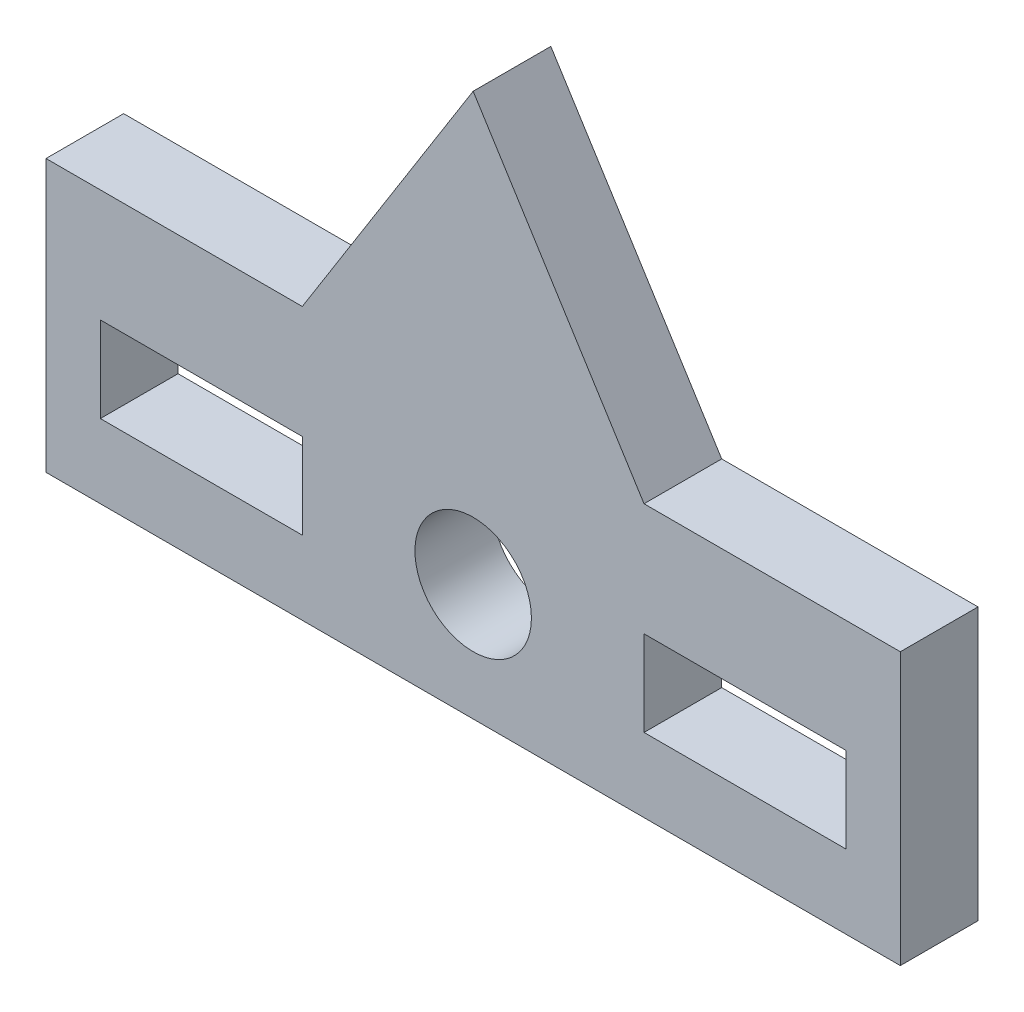
ISO-10303-21;
HEADER;
FILE_DESCRIPTION(('STEP AP214'),'2;1');
FILE_NAME('part.step','',(''),(''),'','','');
FILE_SCHEMA(('AUTOMOTIVE_DESIGN { 1 0 10303 214 1 1 1 1 }'));
ENDSEC;
DATA;
#1=APPLICATION_CONTEXT('core data for automotive mechanical design processes');
#2=APPLICATION_PROTOCOL_DEFINITION('international standard','automotive_design',2000,#1);
#3=PRODUCT_CONTEXT('',#1,'mechanical');
#4=PRODUCT('Part','Part','',(#3));
#5=PRODUCT_RELATED_PRODUCT_CATEGORY('part','',(#4));
#6=PRODUCT_DEFINITION_FORMATION('','',#4);
#7=PRODUCT_DEFINITION_CONTEXT('part definition',#1,'design');
#8=PRODUCT_DEFINITION('design','',#6,#7);
#9=PRODUCT_DEFINITION_SHAPE('','',#8);
#10=(LENGTH_UNIT() NAMED_UNIT(*) SI_UNIT(.MILLI.,.METRE.));
#11=(NAMED_UNIT(*) PLANE_ANGLE_UNIT() SI_UNIT($,.RADIAN.));
#12=(NAMED_UNIT(*) SI_UNIT($,.STERADIAN.) SOLID_ANGLE_UNIT());
#13=UNCERTAINTY_MEASURE_WITH_UNIT(LENGTH_MEASURE(1.E-05),#10,'distance_accuracy_value','');
#14=(GEOMETRIC_REPRESENTATION_CONTEXT(3) GLOBAL_UNCERTAINTY_ASSIGNED_CONTEXT((#13)) GLOBAL_UNIT_ASSIGNED_CONTEXT((#10,
#11,#12)) REPRESENTATION_CONTEXT('',''));
#15=CARTESIAN_POINT('',(0.,0.,0.));
#16=DIRECTION('',(0.,0.,1.));
#17=DIRECTION('',(1.,0.,0.));
#18=AXIS2_PLACEMENT_3D('',#15,#16,#17);
#19=CARTESIAN_POINT('',(0.,0.,2.));
#20=DIRECTION('',(0.,0.,1.));
#21=DIRECTION('',(1.,0.,0.));
#22=AXIS2_PLACEMENT_3D('',#19,#20,#21);
#23=PLANE('',#22);
#24=DIRECTION('',(-0.532171545218346,0.846636549211005,0.));
#25=VECTOR('',#24,1.);
#26=CARTESIAN_POINT('',(0.,11.,2.));
#27=LINE('',#26,#25);
#28=CARTESIAN_POINT('',(4.4,4.,2.));
#29=VERTEX_POINT('',#28);
#30=CARTESIAN_POINT('',(0.,11.,2.));
#31=VERTEX_POINT('',#30);
#32=EDGE_CURVE('E214',#29,#31,#27,.T.);
#33=ORIENTED_EDGE('',*,*,#32,.T.);
#34=DIRECTION('',(-0.532171545218346,-0.846636549211005,0.));
#35=VECTOR('',#34,1.);
#36=CARTESIAN_POINT('',(-4.4,4.,2.));
#37=LINE('',#36,#35);
#38=CARTESIAN_POINT('',(-4.4,4.,2.));
#39=VERTEX_POINT('',#38);
#40=EDGE_CURVE('E217',#31,#39,#37,.T.);
#41=ORIENTED_EDGE('',*,*,#40,.T.);
#42=DIRECTION('',(-1.,0.,0.));
#43=VECTOR('',#42,1.);
#44=CARTESIAN_POINT('',(-11.,4.,2.));
#45=LINE('',#44,#43);
#46=CARTESIAN_POINT('',(-11.,4.,2.));
#47=VERTEX_POINT('',#46);
#48=EDGE_CURVE('E220',#39,#47,#45,.T.);
#49=ORIENTED_EDGE('',*,*,#48,.T.);
#50=DIRECTION('',(0.,-1.,0.));
#51=VECTOR('',#50,1.);
#52=CARTESIAN_POINT('',(-11.,0.,2.));
#53=LINE('',#52,#51);
#54=CARTESIAN_POINT('',(-11.,-3.,2.));
#55=VERTEX_POINT('',#54);
#56=EDGE_CURVE('E222',#47,#55,#53,.T.);
#57=ORIENTED_EDGE('',*,*,#56,.T.);
#58=DIRECTION('',(1.,0.,0.));
#59=VECTOR('',#58,1.);
#60=CARTESIAN_POINT('',(-11.,-3.,2.));
#61=LINE('',#60,#59);
#62=CARTESIAN_POINT('',(11.,-3.,2.));
#63=VERTEX_POINT('',#62);
#64=EDGE_CURVE('E224',#55,#63,#61,.T.);
#65=ORIENTED_EDGE('',*,*,#64,.T.);
#66=DIRECTION('',(0.,1.,0.));
#67=VECTOR('',#66,1.);
#68=CARTESIAN_POINT('',(11.,0.,2.));
#69=LINE('',#68,#67);
#70=CARTESIAN_POINT('',(11.,4.,2.));
#71=VERTEX_POINT('',#70);
#72=EDGE_CURVE('E226',#63,#71,#69,.T.);
#73=ORIENTED_EDGE('',*,*,#72,.T.);
#74=DIRECTION('',(-1.,0.,0.));
#75=VECTOR('',#74,1.);
#76=CARTESIAN_POINT('',(4.4,4.,2.));
#77=LINE('',#76,#75);
#78=EDGE_CURVE('E228',#71,#29,#77,.T.);
#79=ORIENTED_EDGE('',*,*,#78,.T.);
#80=EDGE_LOOP('',(#33,#41,#49,#57,#65,#73,#79));
#81=FACE_BOUND('',#80,.T.);
#82=CARTESIAN_POINT('',(0.,0.,2.));
#83=DIRECTION('',(0.,0.,1.));
#84=DIRECTION('',(1.,0.,0.));
#85=AXIS2_PLACEMENT_3D('',#82,#83,#84);
#86=CIRCLE('',#85,1.5);
#87=CARTESIAN_POINT('',(1.5,0.,2.));
#88=VERTEX_POINT('',#87);
#89=EDGE_CURVE('E208',#88,#88,#86,.T.);
#90=ORIENTED_EDGE('',*,*,#89,.F.);
#91=EDGE_LOOP('',(#90));
#92=FACE_BOUND('',#91,.T.);
#93=DIRECTION('',(1.,0.,0.));
#94=VECTOR('',#93,1.);
#95=CARTESIAN_POINT('',(9.6,-1.1,2.));
#96=LINE('',#95,#94);
#97=CARTESIAN_POINT('',(4.4,-1.1,2.));
#98=VERTEX_POINT('',#97);
#99=CARTESIAN_POINT('',(9.6,-1.1,2.));
#100=VERTEX_POINT('',#99);
#101=EDGE_CURVE('E179',#98,#100,#96,.T.);
#102=ORIENTED_EDGE('',*,*,#101,.F.);
#103=DIRECTION('',(0.,-1.,0.));
#104=VECTOR('',#103,1.);
#105=CARTESIAN_POINT('',(4.4,1.1,2.));
#106=LINE('',#105,#104);
#107=CARTESIAN_POINT('',(4.4,1.1,2.));
#108=VERTEX_POINT('',#107);
#109=EDGE_CURVE('E177',#108,#98,#106,.T.);
#110=ORIENTED_EDGE('',*,*,#109,.F.);
#111=DIRECTION('',(-1.,0.,0.));
#112=VECTOR('',#111,1.);
#113=CARTESIAN_POINT('',(9.6,1.1,2.));
#114=LINE('',#113,#112);
#115=CARTESIAN_POINT('',(9.6,1.1,2.));
#116=VERTEX_POINT('',#115);
#117=EDGE_CURVE('E185',#116,#108,#114,.T.);
#118=ORIENTED_EDGE('',*,*,#117,.F.);
#119=DIRECTION('',(0.,1.,0.));
#120=VECTOR('',#119,1.);
#121=CARTESIAN_POINT('',(9.6,1.1,2.));
#122=LINE('',#121,#120);
#123=EDGE_CURVE('E182',#100,#116,#122,.T.);
#124=ORIENTED_EDGE('',*,*,#123,.F.);
#125=EDGE_LOOP('',(#102,#110,#118,#124));
#126=FACE_BOUND('',#125,.T.);
#127=DIRECTION('',(1.,0.,0.));
#128=VECTOR('',#127,1.);
#129=CARTESIAN_POINT('',(-9.6,-1.1,2.));
#130=LINE('',#129,#128);
#131=CARTESIAN_POINT('',(-9.6,-1.1,2.));
#132=VERTEX_POINT('',#131);
#133=CARTESIAN_POINT('',(-4.4,-1.1,2.));
#134=VERTEX_POINT('',#133);
#135=EDGE_CURVE('E149',#132,#134,#130,.T.);
#136=ORIENTED_EDGE('',*,*,#135,.F.);
#137=DIRECTION('',(0.,-1.,0.));
#138=VECTOR('',#137,1.);
#139=CARTESIAN_POINT('',(-9.6,1.1,2.));
#140=LINE('',#139,#138);
#141=CARTESIAN_POINT('',(-9.6,1.1,2.));
#142=VERTEX_POINT('',#141);
#143=EDGE_CURVE('E141',#142,#132,#140,.T.);
#144=ORIENTED_EDGE('',*,*,#143,.F.);
#145=DIRECTION('',(-1.,0.,0.));
#146=VECTOR('',#145,1.);
#147=CARTESIAN_POINT('',(-9.6,1.1,2.));
#148=LINE('',#147,#146);
#149=CARTESIAN_POINT('',(-4.4,1.1,2.));
#150=VERTEX_POINT('',#149);
#151=EDGE_CURVE('E163',#150,#142,#148,.T.);
#152=ORIENTED_EDGE('',*,*,#151,.F.);
#153=DIRECTION('',(0.,1.,0.));
#154=VECTOR('',#153,1.);
#155=CARTESIAN_POINT('',(-4.4,1.1,2.));
#156=LINE('',#155,#154);
#157=EDGE_CURVE('E161',#134,#150,#156,.T.);
#158=ORIENTED_EDGE('',*,*,#157,.F.);
#159=EDGE_LOOP('',(#136,#144,#152,#158));
#160=FACE_BOUND('',#159,.T.);
#161=ADVANCED_FACE('F34',(#81,#92,#126,#160),#23,.T.);
#162=CARTESIAN_POINT('',(0.,0.,0.));
#163=DIRECTION('',(0.,0.,1.));
#164=DIRECTION('',(1.,0.,0.));
#165=AXIS2_PLACEMENT_3D('',#162,#163,#164);
#166=PLANE('',#165);
#167=DIRECTION('',(0.,-1.,0.));
#168=VECTOR('',#167,1.);
#169=CARTESIAN_POINT('',(4.4,1.1,0.));
#170=LINE('',#169,#168);
#171=CARTESIAN_POINT('',(4.4,1.1,0.));
#172=VERTEX_POINT('',#171);
#173=CARTESIAN_POINT('',(4.4,-1.1,0.));
#174=VERTEX_POINT('',#173);
#175=EDGE_CURVE('E157',#172,#174,#170,.T.);
#176=ORIENTED_EDGE('',*,*,#175,.T.);
#177=DIRECTION('',(1.,0.,0.));
#178=VECTOR('',#177,1.);
#179=CARTESIAN_POINT('',(9.6,-1.1,0.));
#180=LINE('',#179,#178);
#181=CARTESIAN_POINT('',(9.6,-1.1,0.));
#182=VERTEX_POINT('',#181);
#183=EDGE_CURVE('E190',#174,#182,#180,.T.);
#184=ORIENTED_EDGE('',*,*,#183,.T.);
#185=DIRECTION('',(0.,1.,0.));
#186=VECTOR('',#185,1.);
#187=CARTESIAN_POINT('',(9.6,1.1,0.));
#188=LINE('',#187,#186);
#189=CARTESIAN_POINT('',(9.6,1.1,0.));
#190=VERTEX_POINT('',#189);
#191=EDGE_CURVE('E193',#182,#190,#188,.T.);
#192=ORIENTED_EDGE('',*,*,#191,.T.);
#193=DIRECTION('',(-1.,0.,0.));
#194=VECTOR('',#193,1.);
#195=CARTESIAN_POINT('',(9.6,1.1,0.));
#196=LINE('',#195,#194);
#197=EDGE_CURVE('E180',#190,#172,#196,.T.);
#198=ORIENTED_EDGE('',*,*,#197,.T.);
#199=EDGE_LOOP('',(#176,#184,#192,#198));
#200=FACE_BOUND('',#199,.T.);
#201=DIRECTION('',(-0.532171545218346,0.846636549211005,0.));
#202=VECTOR('',#201,1.);
#203=CARTESIAN_POINT('',(0.,11.,0.));
#204=LINE('',#203,#202);
#205=CARTESIAN_POINT('',(4.4,4.,0.));
#206=VERTEX_POINT('',#205);
#207=CARTESIAN_POINT('',(0.,11.,0.));
#208=VERTEX_POINT('',#207);
#209=EDGE_CURVE('E211',#206,#208,#204,.T.);
#210=ORIENTED_EDGE('',*,*,#209,.F.);
#211=DIRECTION('',(-1.,0.,0.));
#212=VECTOR('',#211,1.);
#213=CARTESIAN_POINT('',(4.4,4.,0.));
#214=LINE('',#213,#212);
#215=CARTESIAN_POINT('',(11.,4.,0.));
#216=VERTEX_POINT('',#215);
#217=EDGE_CURVE('E218',#216,#206,#214,.T.);
#218=ORIENTED_EDGE('',*,*,#217,.F.);
#219=DIRECTION('',(0.,1.,0.));
#220=VECTOR('',#219,1.);
#221=CARTESIAN_POINT('',(11.,4.,0.));
#222=LINE('',#221,#220);
#223=CARTESIAN_POINT('',(11.,-3.,0.));
#224=VERTEX_POINT('',#223);
#225=EDGE_CURVE('E243',#224,#216,#222,.T.);
#226=ORIENTED_EDGE('',*,*,#225,.F.);
#227=DIRECTION('',(1.,0.,0.));
#228=VECTOR('',#227,1.);
#229=CARTESIAN_POINT('',(-11.,-3.,0.));
#230=LINE('',#229,#228);
#231=CARTESIAN_POINT('',(-11.,-3.,0.));
#232=VERTEX_POINT('',#231);
#233=EDGE_CURVE('E240',#232,#224,#230,.T.);
#234=ORIENTED_EDGE('',*,*,#233,.F.);
#235=DIRECTION('',(0.,-1.,0.));
#236=VECTOR('',#235,1.);
#237=CARTESIAN_POINT('',(-11.,0.,0.));
#238=LINE('',#237,#236);
#239=CARTESIAN_POINT('',(-11.,4.,0.));
#240=VERTEX_POINT('',#239);
#241=EDGE_CURVE('E238',#240,#232,#238,.T.);
#242=ORIENTED_EDGE('',*,*,#241,.F.);
#243=DIRECTION('',(-1.,0.,0.));
#244=VECTOR('',#243,1.);
#245=CARTESIAN_POINT('',(-11.,4.,0.));
#246=LINE('',#245,#244);
#247=CARTESIAN_POINT('',(-4.4,4.,0.));
#248=VERTEX_POINT('',#247);
#249=EDGE_CURVE('E235',#248,#240,#246,.T.);
#250=ORIENTED_EDGE('',*,*,#249,.F.);
#251=DIRECTION('',(-0.532171545218346,-0.846636549211005,0.));
#252=VECTOR('',#251,1.);
#253=CARTESIAN_POINT('',(-4.4,4.,0.));
#254=LINE('',#253,#252);
#255=EDGE_CURVE('E233',#208,#248,#254,.T.);
#256=ORIENTED_EDGE('',*,*,#255,.F.);
#257=EDGE_LOOP('',(#210,#218,#226,#234,#242,#250,#256));
#258=FACE_BOUND('',#257,.T.);
#259=CARTESIAN_POINT('',(0.,0.,0.));
#260=DIRECTION('',(0.,0.,1.));
#261=DIRECTION('',(1.,0.,0.));
#262=AXIS2_PLACEMENT_3D('',#259,#260,#261);
#263=CIRCLE('',#262,1.5);
#264=CARTESIAN_POINT('',(1.5,0.,0.));
#265=VERTEX_POINT('',#264);
#266=EDGE_CURVE('E207',#265,#265,#263,.T.);
#267=ORIENTED_EDGE('',*,*,#266,.T.);
#268=EDGE_LOOP('',(#267));
#269=FACE_BOUND('',#268,.T.);
#270=DIRECTION('',(0.,-1.,0.));
#271=VECTOR('',#270,1.);
#272=CARTESIAN_POINT('',(-9.6,1.1,0.));
#273=LINE('',#272,#271);
#274=CARTESIAN_POINT('',(-9.6,1.1,0.));
#275=VERTEX_POINT('',#274);
#276=CARTESIAN_POINT('',(-9.6,-1.1,0.));
#277=VERTEX_POINT('',#276);
#278=EDGE_CURVE('E57',#275,#277,#273,.T.);
#279=ORIENTED_EDGE('',*,*,#278,.T.);
#280=DIRECTION('',(1.,0.,0.));
#281=VECTOR('',#280,1.);
#282=CARTESIAN_POINT('',(-9.6,-1.1,0.));
#283=LINE('',#282,#281);
#284=CARTESIAN_POINT('',(-4.4,-1.1,0.));
#285=VERTEX_POINT('',#284);
#286=EDGE_CURVE('E156',#277,#285,#283,.T.);
#287=ORIENTED_EDGE('',*,*,#286,.T.);
#288=DIRECTION('',(0.,1.,0.));
#289=VECTOR('',#288,1.);
#290=CARTESIAN_POINT('',(-4.4,1.1,0.));
#291=LINE('',#290,#289);
#292=CARTESIAN_POINT('',(-4.4,1.1,0.));
#293=VERTEX_POINT('',#292);
#294=EDGE_CURVE('E169',#285,#293,#291,.T.);
#295=ORIENTED_EDGE('',*,*,#294,.T.);
#296=DIRECTION('',(-1.,0.,0.));
#297=VECTOR('',#296,1.);
#298=CARTESIAN_POINT('',(-9.6,1.1,0.));
#299=LINE('',#298,#297);
#300=EDGE_CURVE('E150',#293,#275,#299,.T.);
#301=ORIENTED_EDGE('',*,*,#300,.T.);
#302=EDGE_LOOP('',(#279,#287,#295,#301));
#303=FACE_BOUND('',#302,.T.);
#304=ADVANCED_FACE('F269',(#200,#258,#269,#303),#166,.F.);
#305=CARTESIAN_POINT('',(0.,11.,2.));
#306=DIRECTION('',(-0.846636549211005,-0.532171545218346,0.));
#307=DIRECTION('',(0.532171545218346,-0.846636549211005,0.));
#308=AXIS2_PLACEMENT_3D('',#305,#306,#307);
#309=PLANE('',#308);
#310=ORIENTED_EDGE('',*,*,#209,.T.);
#311=DIRECTION('',(0.,0.,-1.));
#312=VECTOR('',#311,1.);
#313=CARTESIAN_POINT('',(0.,11.,2.));
#314=LINE('',#313,#312);
#315=EDGE_CURVE('E11',#31,#208,#314,.T.);
#316=ORIENTED_EDGE('',*,*,#315,.F.);
#317=ORIENTED_EDGE('',*,*,#32,.F.);
#318=DIRECTION('',(0.,0.,-1.));
#319=VECTOR('',#318,1.);
#320=CARTESIAN_POINT('',(4.4,4.,2.));
#321=LINE('',#320,#319);
#322=EDGE_CURVE('E230',#29,#206,#321,.T.);
#323=ORIENTED_EDGE('',*,*,#322,.T.);
#324=EDGE_LOOP('',(#310,#316,#317,#323));
#325=FACE_BOUND('',#324,.T.);
#326=ADVANCED_FACE('F36',(#325),#309,.F.);
#327=CARTESIAN_POINT('',(-4.4,4.,2.));
#328=DIRECTION('',(0.846636549211005,-0.532171545218346,0.));
#329=DIRECTION('',(0.532171545218346,0.846636549211005,0.));
#330=AXIS2_PLACEMENT_3D('',#327,#328,#329);
#331=PLANE('',#330);
#332=ORIENTED_EDGE('',*,*,#255,.T.);
#333=DIRECTION('',(0.,0.,-1.));
#334=VECTOR('',#333,1.);
#335=CARTESIAN_POINT('',(-4.4,4.,2.));
#336=LINE('',#335,#334);
#337=EDGE_CURVE('E42',#39,#248,#336,.T.);
#338=ORIENTED_EDGE('',*,*,#337,.F.);
#339=ORIENTED_EDGE('',*,*,#40,.F.);
#340=ORIENTED_EDGE('',*,*,#315,.T.);
#341=EDGE_LOOP('',(#332,#338,#339,#340));
#342=FACE_BOUND('',#341,.T.);
#343=ADVANCED_FACE('F286',(#342),#331,.F.);
#344=CARTESIAN_POINT('',(-11.,4.,2.));
#345=DIRECTION('',(0.,-1.,0.));
#346=DIRECTION('',(0.,0.,-1.));
#347=AXIS2_PLACEMENT_3D('',#344,#345,#346);
#348=PLANE('',#347);
#349=ORIENTED_EDGE('',*,*,#249,.T.);
#350=DIRECTION('',(0.,0.,-1.));
#351=VECTOR('',#350,1.);
#352=CARTESIAN_POINT('',(-11.,4.,2.));
#353=LINE('',#352,#351);
#354=EDGE_CURVE('E257',#47,#240,#353,.T.);
#355=ORIENTED_EDGE('',*,*,#354,.F.);
#356=ORIENTED_EDGE('',*,*,#48,.F.);
#357=ORIENTED_EDGE('',*,*,#337,.T.);
#358=EDGE_LOOP('',(#349,#355,#356,#357));
#359=FACE_BOUND('',#358,.T.);
#360=ADVANCED_FACE('F264',(#359),#348,.F.);
#361=CARTESIAN_POINT('',(-11.,0.,2.));
#362=DIRECTION('',(1.,0.,0.));
#363=DIRECTION('',(0.,0.,-1.));
#364=AXIS2_PLACEMENT_3D('',#361,#362,#363);
#365=PLANE('',#364);
#366=ORIENTED_EDGE('',*,*,#241,.T.);
#367=DIRECTION('',(0.,0.,-1.));
#368=VECTOR('',#367,1.);
#369=CARTESIAN_POINT('',(-11.,-3.,2.));
#370=LINE('',#369,#368);
#371=EDGE_CURVE('E254',#55,#232,#370,.T.);
#372=ORIENTED_EDGE('',*,*,#371,.F.);
#373=ORIENTED_EDGE('',*,*,#56,.F.);
#374=ORIENTED_EDGE('',*,*,#354,.T.);
#375=EDGE_LOOP('',(#366,#372,#373,#374));
#376=FACE_BOUND('',#375,.T.);
#377=ADVANCED_FACE('F274',(#376),#365,.F.);
#378=CARTESIAN_POINT('',(-11.,-3.,2.));
#379=DIRECTION('',(0.,1.,0.));
#380=DIRECTION('',(0.,0.,1.));
#381=AXIS2_PLACEMENT_3D('',#378,#379,#380);
#382=PLANE('',#381);
#383=ORIENTED_EDGE('',*,*,#233,.T.);
#384=DIRECTION('',(0.,0.,-1.));
#385=VECTOR('',#384,1.);
#386=CARTESIAN_POINT('',(11.,-3.,2.));
#387=LINE('',#386,#385);
#388=EDGE_CURVE('E251',#63,#224,#387,.T.);
#389=ORIENTED_EDGE('',*,*,#388,.F.);
#390=ORIENTED_EDGE('',*,*,#64,.F.);
#391=ORIENTED_EDGE('',*,*,#371,.T.);
#392=EDGE_LOOP('',(#383,#389,#390,#391));
#393=FACE_BOUND('',#392,.T.);
#394=ADVANCED_FACE('F278',(#393),#382,.F.);
#395=CARTESIAN_POINT('',(11.,4.,2.));
#396=DIRECTION('',(-1.,0.,0.));
#397=DIRECTION('',(0.,0.,1.));
#398=AXIS2_PLACEMENT_3D('',#395,#396,#397);
#399=PLANE('',#398);
#400=ORIENTED_EDGE('',*,*,#225,.T.);
#401=DIRECTION('',(0.,0.,-1.));
#402=VECTOR('',#401,1.);
#403=CARTESIAN_POINT('',(11.,4.,2.));
#404=LINE('',#403,#402);
#405=EDGE_CURVE('E248',#71,#216,#404,.T.);
#406=ORIENTED_EDGE('',*,*,#405,.F.);
#407=ORIENTED_EDGE('',*,*,#72,.F.);
#408=ORIENTED_EDGE('',*,*,#388,.T.);
#409=EDGE_LOOP('',(#400,#406,#407,#408));
#410=FACE_BOUND('',#409,.T.);
#411=ADVANCED_FACE('F294',(#410),#399,.F.);
#412=CARTESIAN_POINT('',(4.4,4.,2.));
#413=DIRECTION('',(0.,-1.,0.));
#414=DIRECTION('',(0.,0.,-1.));
#415=AXIS2_PLACEMENT_3D('',#412,#413,#414);
#416=PLANE('',#415);
#417=ORIENTED_EDGE('',*,*,#217,.T.);
#418=ORIENTED_EDGE('',*,*,#322,.F.);
#419=ORIENTED_EDGE('',*,*,#78,.F.);
#420=ORIENTED_EDGE('',*,*,#405,.T.);
#421=EDGE_LOOP('',(#417,#418,#419,#420));
#422=FACE_BOUND('',#421,.T.);
#423=ADVANCED_FACE('F291',(#422),#416,.F.);
#424=CARTESIAN_POINT('',(0.,0.,2.));
#425=DIRECTION('',(0.,0.,-1.));
#426=DIRECTION('',(-1.,0.,0.));
#427=AXIS2_PLACEMENT_3D('',#424,#425,#426);
#428=CYLINDRICAL_SURFACE('',#427,1.5);
#429=ORIENTED_EDGE('',*,*,#89,.T.);
#430=EDGE_LOOP('',(#429));
#431=FACE_BOUND('',#430,.T.);
#432=ORIENTED_EDGE('',*,*,#266,.F.);
#433=EDGE_LOOP('',(#432));
#434=FACE_BOUND('',#433,.T.);
#435=ADVANCED_FACE('F301',(#431,#434),#428,.F.);
#436=CARTESIAN_POINT('',(4.4,1.1,2.));
#437=DIRECTION('',(1.,0.,0.));
#438=DIRECTION('',(0.,0.,-1.));
#439=AXIS2_PLACEMENT_3D('',#436,#437,#438);
#440=PLANE('',#439);
#441=ORIENTED_EDGE('',*,*,#175,.F.);
#442=DIRECTION('',(0.,0.,-1.));
#443=VECTOR('',#442,1.);
#444=CARTESIAN_POINT('',(4.4,1.1,2.));
#445=LINE('',#444,#443);
#446=EDGE_CURVE('E187',#108,#172,#445,.T.);
#447=ORIENTED_EDGE('',*,*,#446,.F.);
#448=ORIENTED_EDGE('',*,*,#109,.T.);
#449=DIRECTION('',(0.,0.,-1.));
#450=VECTOR('',#449,1.);
#451=CARTESIAN_POINT('',(4.4,-1.1,2.));
#452=LINE('',#451,#450);
#453=EDGE_CURVE('E204',#98,#174,#452,.T.);
#454=ORIENTED_EDGE('',*,*,#453,.T.);
#455=EDGE_LOOP('',(#441,#447,#448,#454));
#456=FACE_BOUND('',#455,.T.);
#457=ADVANCED_FACE('F314',(#456),#440,.T.);
#458=CARTESIAN_POINT('',(9.6,-1.1,2.));
#459=DIRECTION('',(0.,1.,0.));
#460=DIRECTION('',(-1.,0.,0.));
#461=AXIS2_PLACEMENT_3D('',#458,#459,#460);
#462=PLANE('',#461);
#463=ORIENTED_EDGE('',*,*,#183,.F.);
#464=ORIENTED_EDGE('',*,*,#453,.F.);
#465=ORIENTED_EDGE('',*,*,#101,.T.);
#466=DIRECTION('',(0.,0.,-1.));
#467=VECTOR('',#466,1.);
#468=CARTESIAN_POINT('',(9.6,-1.1,2.));
#469=LINE('',#468,#467);
#470=EDGE_CURVE('E202',#100,#182,#469,.T.);
#471=ORIENTED_EDGE('',*,*,#470,.T.);
#472=EDGE_LOOP('',(#463,#464,#465,#471));
#473=FACE_BOUND('',#472,.T.);
#474=ADVANCED_FACE('F318',(#473),#462,.T.);
#475=CARTESIAN_POINT('',(9.6,1.1,2.));
#476=DIRECTION('',(-1.,0.,0.));
#477=DIRECTION('',(0.,0.,1.));
#478=AXIS2_PLACEMENT_3D('',#475,#476,#477);
#479=PLANE('',#478);
#480=ORIENTED_EDGE('',*,*,#191,.F.);
#481=ORIENTED_EDGE('',*,*,#470,.F.);
#482=ORIENTED_EDGE('',*,*,#123,.T.);
#483=DIRECTION('',(0.,0.,-1.));
#484=VECTOR('',#483,1.);
#485=CARTESIAN_POINT('',(9.6,1.1,2.));
#486=LINE('',#485,#484);
#487=EDGE_CURVE('E200',#116,#190,#486,.T.);
#488=ORIENTED_EDGE('',*,*,#487,.T.);
#489=EDGE_LOOP('',(#480,#481,#482,#488));
#490=FACE_BOUND('',#489,.T.);
#491=ADVANCED_FACE('F322',(#490),#479,.T.);
#492=CARTESIAN_POINT('',(9.6,1.1,2.));
#493=DIRECTION('',(0.,-1.,0.));
#494=DIRECTION('',(1.,0.,0.));
#495=AXIS2_PLACEMENT_3D('',#492,#493,#494);
#496=PLANE('',#495);
#497=ORIENTED_EDGE('',*,*,#197,.F.);
#498=ORIENTED_EDGE('',*,*,#487,.F.);
#499=ORIENTED_EDGE('',*,*,#117,.T.);
#500=ORIENTED_EDGE('',*,*,#446,.T.);
#501=EDGE_LOOP('',(#497,#498,#499,#500));
#502=FACE_BOUND('',#501,.T.);
#503=ADVANCED_FACE('F326',(#502),#496,.T.);
#504=CARTESIAN_POINT('',(-9.6,1.1,2.));
#505=DIRECTION('',(1.,0.,0.));
#506=DIRECTION('',(0.,0.,-1.));
#507=AXIS2_PLACEMENT_3D('',#504,#505,#506);
#508=PLANE('',#507);
#509=ORIENTED_EDGE('',*,*,#278,.F.);
#510=DIRECTION('',(0.,0.,-1.));
#511=VECTOR('',#510,1.);
#512=CARTESIAN_POINT('',(-9.6,1.1,2.));
#513=LINE('',#512,#511);
#514=EDGE_CURVE('E145',#142,#275,#513,.T.);
#515=ORIENTED_EDGE('',*,*,#514,.F.);
#516=ORIENTED_EDGE('',*,*,#143,.T.);
#517=DIRECTION('',(0.,0.,-1.));
#518=VECTOR('',#517,1.);
#519=CARTESIAN_POINT('',(-9.6,-1.1,2.));
#520=LINE('',#519,#518);
#521=EDGE_CURVE('E144',#132,#277,#520,.T.);
#522=ORIENTED_EDGE('',*,*,#521,.T.);
#523=EDGE_LOOP('',(#509,#515,#516,#522));
#524=FACE_BOUND('',#523,.T.);
#525=ADVANCED_FACE('F143',(#524),#508,.T.);
#526=CARTESIAN_POINT('',(-9.6,-1.1,2.));
#527=DIRECTION('',(0.,1.,0.));
#528=DIRECTION('',(-1.,0.,0.));
#529=AXIS2_PLACEMENT_3D('',#526,#527,#528);
#530=PLANE('',#529);
#531=ORIENTED_EDGE('',*,*,#286,.F.);
#532=ORIENTED_EDGE('',*,*,#521,.F.);
#533=ORIENTED_EDGE('',*,*,#135,.T.);
#534=DIRECTION('',(0.,0.,-1.));
#535=VECTOR('',#534,1.);
#536=CARTESIAN_POINT('',(-4.4,-1.1,2.));
#537=LINE('',#536,#535);
#538=EDGE_CURVE('E158',#134,#285,#537,.T.);
#539=ORIENTED_EDGE('',*,*,#538,.T.);
#540=EDGE_LOOP('',(#531,#532,#533,#539));
#541=FACE_BOUND('',#540,.T.);
#542=ADVANCED_FACE('F153',(#541),#530,.T.);
#543=CARTESIAN_POINT('',(-4.4,1.1,2.));
#544=DIRECTION('',(-1.,0.,0.));
#545=DIRECTION('',(0.,0.,1.));
#546=AXIS2_PLACEMENT_3D('',#543,#544,#545);
#547=PLANE('',#546);
#548=ORIENTED_EDGE('',*,*,#294,.F.);
#549=ORIENTED_EDGE('',*,*,#538,.F.);
#550=ORIENTED_EDGE('',*,*,#157,.T.);
#551=DIRECTION('',(0.,0.,-1.));
#552=VECTOR('',#551,1.);
#553=CARTESIAN_POINT('',(-4.4,1.1,2.));
#554=LINE('',#553,#552);
#555=EDGE_CURVE('E49',#150,#293,#554,.T.);
#556=ORIENTED_EDGE('',*,*,#555,.T.);
#557=EDGE_LOOP('',(#548,#549,#550,#556));
#558=FACE_BOUND('',#557,.T.);
#559=ADVANCED_FACE('F335',(#558),#547,.T.);
#560=CARTESIAN_POINT('',(-9.6,1.1,2.));
#561=DIRECTION('',(0.,-1.,0.));
#562=DIRECTION('',(1.,0.,0.));
#563=AXIS2_PLACEMENT_3D('',#560,#561,#562);
#564=PLANE('',#563);
#565=ORIENTED_EDGE('',*,*,#300,.F.);
#566=ORIENTED_EDGE('',*,*,#555,.F.);
#567=ORIENTED_EDGE('',*,*,#151,.T.);
#568=ORIENTED_EDGE('',*,*,#514,.T.);
#569=EDGE_LOOP('',(#565,#566,#567,#568));
#570=FACE_BOUND('',#569,.T.);
#571=ADVANCED_FACE('F338',(#570),#564,.T.);
#572=CLOSED_SHELL('',(#161,#304,#326,#343,#360,#377,#394,#411,#423,#435,#457,#474,#491,#503,
#525,#542,#559,#571));
#573=MANIFOLD_SOLID_BREP('B2',#572);
#574=ADVANCED_BREP_SHAPE_REPRESENTATION('',(#18,#573),#14);
#575=SHAPE_DEFINITION_REPRESENTATION(#9,#574);
ENDSEC;
END-ISO-10303-21;
